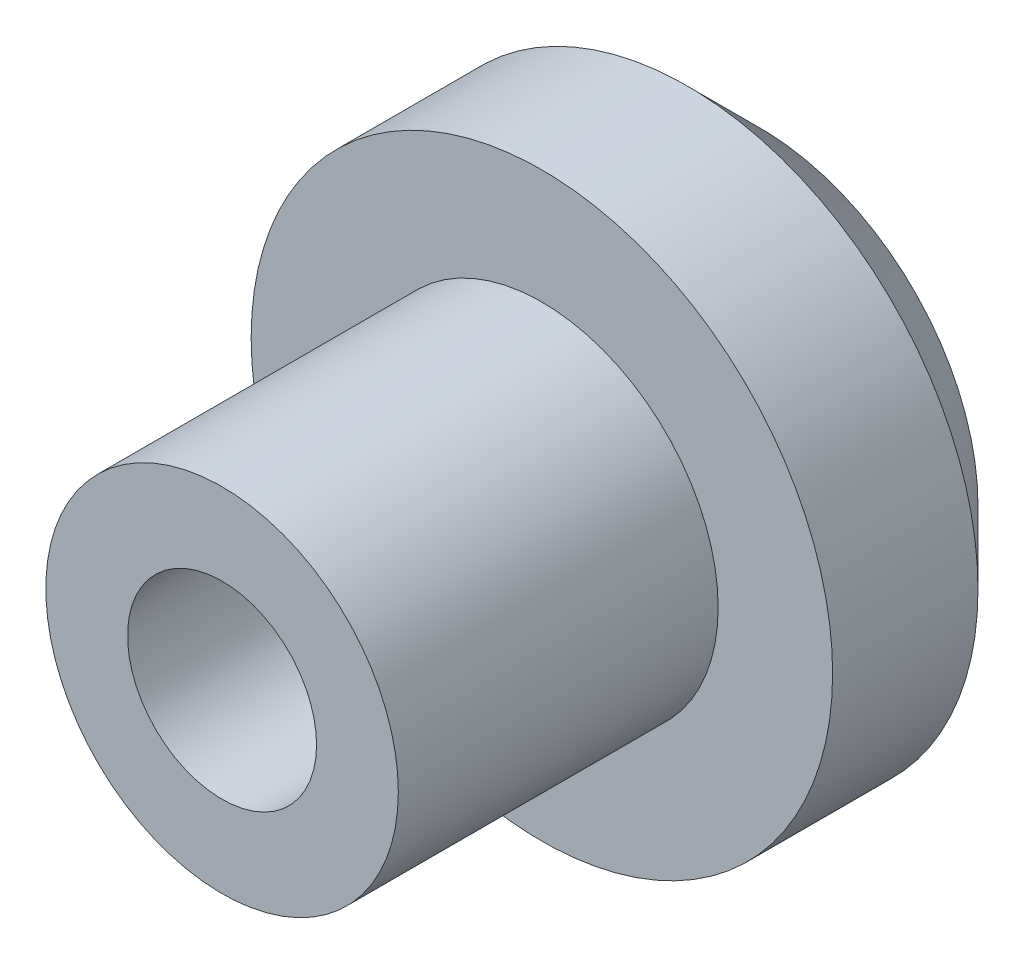
ISO-10303-21;
HEADER;
FILE_DESCRIPTION(('STEP AP214'),'2;1');
FILE_NAME('part.step','',(''),(''),'','','');
FILE_SCHEMA(('AUTOMOTIVE_DESIGN { 1 0 10303 214 1 1 1 1 }'));
ENDSEC;
DATA;
#1=APPLICATION_CONTEXT('core data for automotive mechanical design processes');
#2=APPLICATION_PROTOCOL_DEFINITION('international standard','automotive_design',2000,#1);
#3=PRODUCT_CONTEXT('',#1,'mechanical');
#4=PRODUCT('Part','Part','',(#3));
#5=PRODUCT_RELATED_PRODUCT_CATEGORY('part','',(#4));
#6=PRODUCT_DEFINITION_FORMATION('','',#4);
#7=PRODUCT_DEFINITION_CONTEXT('part definition',#1,'design');
#8=PRODUCT_DEFINITION('design','',#6,#7);
#9=PRODUCT_DEFINITION_SHAPE('','',#8);
#10=(LENGTH_UNIT() NAMED_UNIT(*) SI_UNIT(.MILLI.,.METRE.));
#11=(NAMED_UNIT(*) PLANE_ANGLE_UNIT() SI_UNIT($,.RADIAN.));
#12=(NAMED_UNIT(*) SI_UNIT($,.STERADIAN.) SOLID_ANGLE_UNIT());
#13=UNCERTAINTY_MEASURE_WITH_UNIT(LENGTH_MEASURE(1.E-05),#10,'distance_accuracy_value','');
#14=(GEOMETRIC_REPRESENTATION_CONTEXT(3) GLOBAL_UNCERTAINTY_ASSIGNED_CONTEXT((#13)) GLOBAL_UNIT_ASSIGNED_CONTEXT((#10,
#11,#12)) REPRESENTATION_CONTEXT('',''));
#15=CARTESIAN_POINT('',(0.,0.,0.));
#16=DIRECTION('',(0.,0.,1.));
#17=DIRECTION('',(1.,0.,0.));
#18=AXIS2_PLACEMENT_3D('',#15,#16,#17);
#19=CARTESIAN_POINT('',(0.,0.,3.));
#20=DIRECTION('',(0.,0.,-1.));
#21=DIRECTION('',(-1.,0.,0.));
#22=AXIS2_PLACEMENT_3D('',#19,#20,#21);
#23=CYLINDRICAL_SURFACE('',#22,4.);
#24=CARTESIAN_POINT('',(0.,0.,1.));
#25=DIRECTION('',(0.,0.,1.));
#26=DIRECTION('',(1.,0.,0.));
#27=AXIS2_PLACEMENT_3D('',#24,#25,#26);
#28=CIRCLE('',#27,4.);
#29=CARTESIAN_POINT('',(4.,0.,1.));
#30=VERTEX_POINT('',#29);
#31=EDGE_CURVE('E44',#30,#30,#28,.T.);
#32=ORIENTED_EDGE('',*,*,#31,.T.);
#33=EDGE_LOOP('',(#32));
#34=FACE_BOUND('',#33,.T.);
#35=CARTESIAN_POINT('',(0.,0.,3.));
#36=DIRECTION('',(0.,0.,1.));
#37=DIRECTION('',(1.,0.,0.));
#38=AXIS2_PLACEMENT_3D('',#35,#36,#37);
#39=CIRCLE('',#38,4.);
#40=CARTESIAN_POINT('',(4.,0.,3.));
#41=VERTEX_POINT('',#40);
#42=EDGE_CURVE('E54',#41,#41,#39,.T.);
#43=ORIENTED_EDGE('',*,*,#42,.F.);
#44=EDGE_LOOP('',(#43));
#45=FACE_BOUND('',#44,.T.);
#46=ADVANCED_FACE('F36',(#34,#45),#23,.T.);
#47=CARTESIAN_POINT('',(0.,0.,3.));
#48=DIRECTION('',(0.,0.,1.));
#49=DIRECTION('',(1.,0.,0.));
#50=AXIS2_PLACEMENT_3D('',#47,#48,#49);
#51=PLANE('',#50);
#52=CARTESIAN_POINT('',(0.,0.,3.));
#53=DIRECTION('',(0.,0.,1.));
#54=DIRECTION('',(1.,0.,0.));
#55=AXIS2_PLACEMENT_3D('',#52,#53,#54);
#56=CIRCLE('',#55,2.425);
#57=CARTESIAN_POINT('',(2.425,0.,3.));
#58=VERTEX_POINT('',#57);
#59=EDGE_CURVE('E49',#58,#58,#56,.T.);
#60=ORIENTED_EDGE('',*,*,#59,.F.);
#61=EDGE_LOOP('',(#60));
#62=FACE_BOUND('',#61,.T.);
#63=ORIENTED_EDGE('',*,*,#42,.T.);
#64=EDGE_LOOP('',(#63));
#65=FACE_BOUND('',#64,.T.);
#66=ADVANCED_FACE('F93',(#62,#65),#51,.T.);
#67=CARTESIAN_POINT('',(0.,0.,0.));
#68=DIRECTION('',(0.,0.,1.));
#69=DIRECTION('',(1.,0.,0.));
#70=AXIS2_PLACEMENT_3D('',#67,#68,#69);
#71=PLANE('',#70);
#72=CARTESIAN_POINT('',(0.,0.,0.));
#73=DIRECTION('',(0.,0.,1.));
#74=DIRECTION('',(1.,0.,0.));
#75=AXIS2_PLACEMENT_3D('',#72,#73,#74);
#76=CIRCLE('',#75,3.);
#77=CARTESIAN_POINT('',(3.,0.,0.));
#78=VERTEX_POINT('',#77);
#79=EDGE_CURVE('E10',#78,#78,#76,.F.);
#80=ORIENTED_EDGE('',*,*,#79,.T.);
#81=EDGE_LOOP('',(#80));
#82=FACE_BOUND('',#81,.T.);
#83=CARTESIAN_POINT('',(0.,0.,0.));
#84=DIRECTION('',(0.,0.,1.));
#85=DIRECTION('',(1.,0.,0.));
#86=AXIS2_PLACEMENT_3D('',#83,#84,#85);
#87=CIRCLE('',#86,1.3);
#88=CARTESIAN_POINT('',(1.3,0.,0.));
#89=VERTEX_POINT('',#88);
#90=EDGE_CURVE('E64',#89,#89,#87,.T.);
#91=ORIENTED_EDGE('',*,*,#90,.T.);
#92=EDGE_LOOP('',(#91));
#93=FACE_BOUND('',#92,.T.);
#94=ADVANCED_FACE('F73',(#82,#93),#71,.F.);
#95=CARTESIAN_POINT('',(0.,0.,7.4));
#96=DIRECTION('',(0.,0.,-1.));
#97=DIRECTION('',(-1.,0.,0.));
#98=AXIS2_PLACEMENT_3D('',#95,#96,#97);
#99=CYLINDRICAL_SURFACE('',#98,2.425);
#100=CARTESIAN_POINT('',(0.,0.,7.4));
#101=DIRECTION('',(0.,0.,1.));
#102=DIRECTION('',(1.,0.,0.));
#103=AXIS2_PLACEMENT_3D('',#100,#101,#102);
#104=CIRCLE('',#103,2.425);
#105=CARTESIAN_POINT('',(2.425,0.,7.4));
#106=VERTEX_POINT('',#105);
#107=EDGE_CURVE('E59',#106,#106,#104,.T.);
#108=ORIENTED_EDGE('',*,*,#107,.F.);
#109=EDGE_LOOP('',(#108));
#110=FACE_BOUND('',#109,.T.);
#111=ORIENTED_EDGE('',*,*,#59,.T.);
#112=EDGE_LOOP('',(#111));
#113=FACE_BOUND('',#112,.T.);
#114=ADVANCED_FACE('F84',(#110,#113),#99,.T.);
#115=CARTESIAN_POINT('',(0.,0.,7.4));
#116=DIRECTION('',(0.,0.,1.));
#117=DIRECTION('',(1.,0.,0.));
#118=AXIS2_PLACEMENT_3D('',#115,#116,#117);
#119=PLANE('',#118);
#120=CARTESIAN_POINT('',(0.,0.,7.4));
#121=DIRECTION('',(0.,0.,1.));
#122=DIRECTION('',(1.,0.,0.));
#123=AXIS2_PLACEMENT_3D('',#120,#121,#122);
#124=CIRCLE('',#123,1.3);
#125=CARTESIAN_POINT('',(1.3,0.,7.4));
#126=VERTEX_POINT('',#125);
#127=EDGE_CURVE('E65',#126,#126,#124,.T.);
#128=ORIENTED_EDGE('',*,*,#127,.F.);
#129=EDGE_LOOP('',(#128));
#130=FACE_BOUND('',#129,.T.);
#131=ORIENTED_EDGE('',*,*,#107,.T.);
#132=EDGE_LOOP('',(#131));
#133=FACE_BOUND('',#132,.T.);
#134=ADVANCED_FACE('F78',(#130,#133),#119,.T.);
#135=CARTESIAN_POINT('',(0.,0.,0.));
#136=DIRECTION('',(0.,0.,1.));
#137=DIRECTION('',(1.,0.,0.));
#138=AXIS2_PLACEMENT_3D('',#135,#136,#137);
#139=CYLINDRICAL_SURFACE('',#138,1.3);
#140=ORIENTED_EDGE('',*,*,#90,.F.);
#141=EDGE_LOOP('',(#140));
#142=FACE_BOUND('',#141,.T.);
#143=ORIENTED_EDGE('',*,*,#127,.T.);
#144=EDGE_LOOP('',(#143));
#145=FACE_BOUND('',#144,.T.);
#146=ADVANCED_FACE('F75',(#142,#145),#139,.F.);
#147=CARTESIAN_POINT('',(0.,0.,1.));
#148=DIRECTION('',(0.,0.,1.));
#149=DIRECTION('',(1.,0.,0.));
#150=AXIS2_PLACEMENT_3D('',#147,#148,#149);
#151=CONICAL_SURFACE('',#150,4.,0.78539816339745);
#152=ORIENTED_EDGE('',*,*,#79,.F.);
#153=EDGE_LOOP('',(#152));
#154=FACE_BOUND('',#153,.T.);
#155=ORIENTED_EDGE('',*,*,#31,.F.);
#156=EDGE_LOOP('',(#155));
#157=FACE_BOUND('',#156,.T.);
#158=ADVANCED_FACE('F38',(#154,#157),#151,.T.);
#159=CLOSED_SHELL('',(#46,#66,#94,#114,#134,#146,#158));
#160=MANIFOLD_SOLID_BREP('B2',#159);
#161=ADVANCED_BREP_SHAPE_REPRESENTATION('',(#18,#160),#14);
#162=SHAPE_DEFINITION_REPRESENTATION(#9,#161);
ENDSEC;
END-ISO-10303-21;
